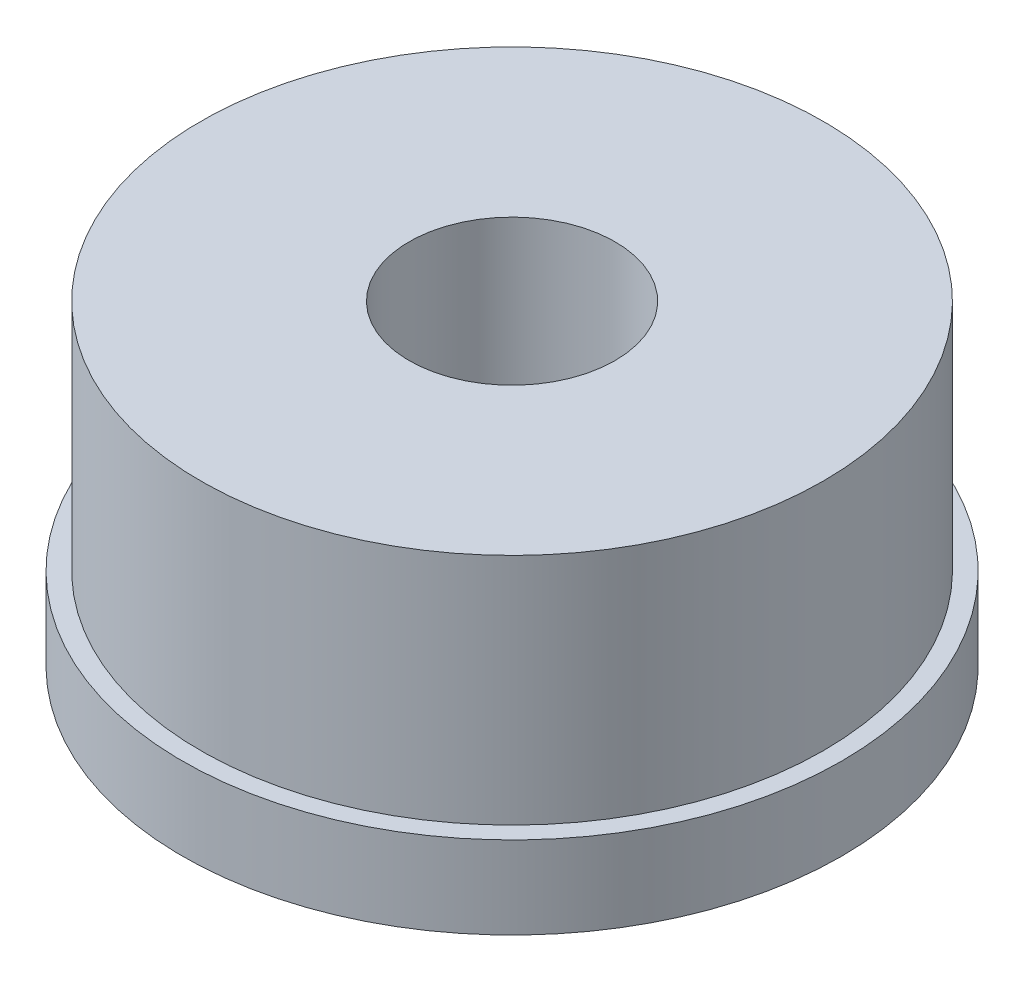
ISO-10303-21;
HEADER;
FILE_DESCRIPTION(('STEP AP214'),'2;1');
FILE_NAME('part.step','',(''),(''),'','','');
FILE_SCHEMA(('AUTOMOTIVE_DESIGN { 1 0 10303 214 1 1 1 1 }'));
ENDSEC;
DATA;
#1=APPLICATION_CONTEXT('core data for automotive mechanical design processes');
#2=APPLICATION_PROTOCOL_DEFINITION('international standard','automotive_design',2000,#1);
#3=PRODUCT_CONTEXT('',#1,'mechanical');
#4=PRODUCT('Part','Part','',(#3));
#5=PRODUCT_RELATED_PRODUCT_CATEGORY('part','',(#4));
#6=PRODUCT_DEFINITION_FORMATION('','',#4);
#7=PRODUCT_DEFINITION_CONTEXT('part definition',#1,'design');
#8=PRODUCT_DEFINITION('design','',#6,#7);
#9=PRODUCT_DEFINITION_SHAPE('','',#8);
#10=(LENGTH_UNIT() NAMED_UNIT(*) SI_UNIT(.MILLI.,.METRE.));
#11=(NAMED_UNIT(*) PLANE_ANGLE_UNIT() SI_UNIT($,.RADIAN.));
#12=(NAMED_UNIT(*) SI_UNIT($,.STERADIAN.) SOLID_ANGLE_UNIT());
#13=UNCERTAINTY_MEASURE_WITH_UNIT(LENGTH_MEASURE(1.E-05),#10,'distance_accuracy_value','');
#14=(GEOMETRIC_REPRESENTATION_CONTEXT(3) GLOBAL_UNCERTAINTY_ASSIGNED_CONTEXT((#13)) GLOBAL_UNIT_ASSIGNED_CONTEXT((#10,
#11,#12)) REPRESENTATION_CONTEXT('',''));
#15=CARTESIAN_POINT('',(0.,0.,0.));
#16=DIRECTION('',(0.,0.,1.));
#17=DIRECTION('',(1.,0.,0.));
#18=AXIS2_PLACEMENT_3D('',#15,#16,#17);
#19=CARTESIAN_POINT('',(1275.15372841955,372.945278521374,121.258293715554));
#20=DIRECTION('',(0.,1.,0.));
#21=DIRECTION('',(0.,0.,1.));
#22=AXIS2_PLACEMENT_3D('',#19,#20,#21);
#23=CYLINDRICAL_SURFACE('',#22,12.);
#24=CARTESIAN_POINT('',(1275.15372841955,415.886404018328,121.258293715554));
#25=DIRECTION('',(0.,-1.,0.));
#26=DIRECTION('',(1.,0.,0.));
#27=AXIS2_PLACEMENT_3D('',#24,#25,#26);
#28=CIRCLE('',#27,12.);
#29=CARTESIAN_POINT('',(1287.15372841955,415.886404018328,121.258293715554));
#30=VERTEX_POINT('',#29);
#31=EDGE_CURVE('E46',#30,#30,#28,.T.);
#32=ORIENTED_EDGE('',*,*,#31,.T.);
#33=EDGE_LOOP('',(#32));
#34=FACE_BOUND('',#33,.T.);
#35=CARTESIAN_POINT('',(1275.15372841955,406.886404018328,121.258293715554));
#36=DIRECTION('',(0.,-1.,0.));
#37=DIRECTION('',(1.,0.,0.));
#38=AXIS2_PLACEMENT_3D('',#35,#36,#37);
#39=CIRCLE('',#38,12.);
#40=CARTESIAN_POINT('',(1287.15372841955,406.886404018328,121.258293715554));
#41=VERTEX_POINT('',#40);
#42=EDGE_CURVE('E10',#41,#41,#39,.T.);
#43=ORIENTED_EDGE('',*,*,#42,.F.);
#44=EDGE_LOOP('',(#43));
#45=FACE_BOUND('',#44,.T.);
#46=ADVANCED_FACE('F43',(#34,#45),#23,.T.);
#47=CARTESIAN_POINT('',(1275.15372841955,415.886404018328,121.258293715554));
#48=DIRECTION('',(0.,-1.,0.));
#49=DIRECTION('',(1.,0.,0.));
#50=AXIS2_PLACEMENT_3D('',#47,#48,#49);
#51=PLANE('',#50);
#52=ORIENTED_EDGE('',*,*,#31,.F.);
#53=EDGE_LOOP('',(#52));
#54=FACE_BOUND('',#53,.T.);
#55=CARTESIAN_POINT('',(1275.15372841955,415.886404018328,121.258293715554));
#56=DIRECTION('',(0.,-1.,0.));
#57=DIRECTION('',(1.,0.,0.));
#58=AXIS2_PLACEMENT_3D('',#55,#56,#57);
#59=CIRCLE('',#58,3.9687500000001);
#60=CARTESIAN_POINT('',(1279.12247841955,415.886404018328,121.258293715554));
#61=VERTEX_POINT('',#60);
#62=EDGE_CURVE('E56',#61,#61,#59,.T.);
#63=ORIENTED_EDGE('',*,*,#62,.T.);
#64=EDGE_LOOP('',(#63));
#65=FACE_BOUND('',#64,.T.);
#66=ADVANCED_FACE('F89',(#54,#65),#51,.F.);
#67=CARTESIAN_POINT('',(1275.15372841955,372.945278521374,121.258293715554));
#68=DIRECTION('',(0.,1.,0.));
#69=DIRECTION('',(0.,0.,1.));
#70=AXIS2_PLACEMENT_3D('',#67,#68,#69);
#71=CYLINDRICAL_SURFACE('',#70,3.9687500000001);
#72=ORIENTED_EDGE('',*,*,#62,.F.);
#73=EDGE_LOOP('',(#72));
#74=FACE_BOUND('',#73,.T.);
#75=CARTESIAN_POINT('',(1275.15372841955,403.711404018328,121.258293715554));
#76=DIRECTION('',(0.,-1.,0.));
#77=DIRECTION('',(1.,0.,0.));
#78=AXIS2_PLACEMENT_3D('',#75,#76,#77);
#79=CIRCLE('',#78,3.9687500000001);
#80=CARTESIAN_POINT('',(1279.12247841955,403.711404018328,121.258293715554));
#81=VERTEX_POINT('',#80);
#82=EDGE_CURVE('E71',#81,#81,#79,.T.);
#83=ORIENTED_EDGE('',*,*,#82,.T.);
#84=EDGE_LOOP('',(#83));
#85=FACE_BOUND('',#84,.T.);
#86=ADVANCED_FACE('F77',(#74,#85),#71,.F.);
#87=CARTESIAN_POINT('',(1275.15372841955,403.711404018328,121.258293715554));
#88=DIRECTION('',(0.,-1.,0.));
#89=DIRECTION('',(1.,0.,0.));
#90=AXIS2_PLACEMENT_3D('',#87,#88,#89);
#91=PLANE('',#90);
#92=CARTESIAN_POINT('',(1275.15372841955,403.711404018328,121.258293715554));
#93=DIRECTION('',(0.,-1.,0.));
#94=DIRECTION('',(1.,0.,0.));
#95=AXIS2_PLACEMENT_3D('',#92,#93,#94);
#96=CIRCLE('',#95,12.6999999999999);
#97=CARTESIAN_POINT('',(1287.85372841955,403.711404018328,121.258293715554));
#98=VERTEX_POINT('',#97);
#99=EDGE_CURVE('E62',#98,#98,#96,.T.);
#100=ORIENTED_EDGE('',*,*,#99,.T.);
#101=EDGE_LOOP('',(#100));
#102=FACE_BOUND('',#101,.T.);
#103=ORIENTED_EDGE('',*,*,#82,.F.);
#104=EDGE_LOOP('',(#103));
#105=FACE_BOUND('',#104,.T.);
#106=ADVANCED_FACE('F79',(#102,#105),#91,.T.);
#107=CARTESIAN_POINT('',(1275.15372841955,406.886404018328,121.258293715554));
#108=DIRECTION('',(0.,-1.,0.));
#109=DIRECTION('',(1.,0.,0.));
#110=AXIS2_PLACEMENT_3D('',#107,#108,#109);
#111=PLANE('',#110);
#112=ORIENTED_EDGE('',*,*,#42,.T.);
#113=EDGE_LOOP('',(#112));
#114=FACE_BOUND('',#113,.T.);
#115=CARTESIAN_POINT('',(1275.15372841955,406.886404018328,121.258293715554));
#116=DIRECTION('',(0.,-1.,0.));
#117=DIRECTION('',(1.,0.,0.));
#118=AXIS2_PLACEMENT_3D('',#115,#116,#117);
#119=CIRCLE('',#118,12.6999999999999);
#120=CARTESIAN_POINT('',(1287.85372841955,406.886404018328,121.258293715554));
#121=VERTEX_POINT('',#120);
#122=EDGE_CURVE('E58',#121,#121,#119,.T.);
#123=ORIENTED_EDGE('',*,*,#122,.F.);
#124=EDGE_LOOP('',(#123));
#125=FACE_BOUND('',#124,.T.);
#126=ADVANCED_FACE('F81',(#114,#125),#111,.F.);
#127=CARTESIAN_POINT('',(1275.15372841955,403.711404018328,121.258293715554));
#128=DIRECTION('',(0.,1.,0.));
#129=DIRECTION('',(-1.,0.,0.));
#130=AXIS2_PLACEMENT_3D('',#127,#128,#129);
#131=CYLINDRICAL_SURFACE('',#130,12.6999999999999);
#132=ORIENTED_EDGE('',*,*,#99,.F.);
#133=EDGE_LOOP('',(#132));
#134=FACE_BOUND('',#133,.T.);
#135=ORIENTED_EDGE('',*,*,#122,.T.);
#136=EDGE_LOOP('',(#135));
#137=FACE_BOUND('',#136,.T.);
#138=ADVANCED_FACE('F87',(#134,#137),#131,.T.);
#139=CLOSED_SHELL('',(#46,#66,#86,#106,#126,#138));
#140=MANIFOLD_SOLID_BREP('B2',#139);
#141=ADVANCED_BREP_SHAPE_REPRESENTATION('',(#18,#140),#14);
#142=SHAPE_DEFINITION_REPRESENTATION(#9,#141);
ENDSEC;
END-ISO-10303-21;
